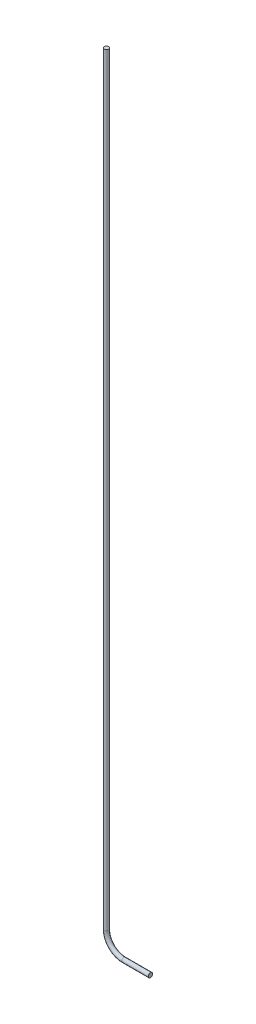
ISO-10303-21;
HEADER;
FILE_DESCRIPTION(('STEP AP214'),'2;1');
FILE_NAME('part.step','',(''),(''),'','','');
FILE_SCHEMA(('AUTOMOTIVE_DESIGN { 1 0 10303 214 1 1 1 1 }'));
ENDSEC;
DATA;
#1=APPLICATION_CONTEXT('core data for automotive mechanical design processes');
#2=APPLICATION_PROTOCOL_DEFINITION('international standard','automotive_design',2000,#1);
#3=PRODUCT_CONTEXT('',#1,'mechanical');
#4=PRODUCT('Part','Part','',(#3));
#5=PRODUCT_RELATED_PRODUCT_CATEGORY('part','',(#4));
#6=PRODUCT_DEFINITION_FORMATION('','',#4);
#7=PRODUCT_DEFINITION_CONTEXT('part definition',#1,'design');
#8=PRODUCT_DEFINITION('design','',#6,#7);
#9=PRODUCT_DEFINITION_SHAPE('','',#8);
#10=(LENGTH_UNIT() NAMED_UNIT(*) SI_UNIT(.MILLI.,.METRE.));
#11=(NAMED_UNIT(*) PLANE_ANGLE_UNIT() SI_UNIT($,.RADIAN.));
#12=(NAMED_UNIT(*) SI_UNIT($,.STERADIAN.) SOLID_ANGLE_UNIT());
#13=UNCERTAINTY_MEASURE_WITH_UNIT(LENGTH_MEASURE(1.E-05),#10,'distance_accuracy_value','');
#14=(GEOMETRIC_REPRESENTATION_CONTEXT(3) GLOBAL_UNCERTAINTY_ASSIGNED_CONTEXT((#13)) GLOBAL_UNIT_ASSIGNED_CONTEXT((#10,
#11,#12)) REPRESENTATION_CONTEXT('',''));
#15=CARTESIAN_POINT('',(0.,0.,0.));
#16=DIRECTION('',(0.,0.,1.));
#17=DIRECTION('',(1.,0.,0.));
#18=AXIS2_PLACEMENT_3D('',#15,#16,#17);
#19=CARTESIAN_POINT('',(127.,0.,0.));
#20=DIRECTION('',(-1.,0.,0.));
#21=DIRECTION('',(0.,0.,1.));
#22=AXIS2_PLACEMENT_3D('',#19,#20,#21);
#23=PLANE('',#22);
#24=CARTESIAN_POINT('',(127.,0.,0.));
#25=DIRECTION('',(-1.,0.,0.));
#26=DIRECTION('',(0.,0.,1.));
#27=AXIS2_PLACEMENT_3D('',#24,#25,#26);
#28=CIRCLE('',#27,6.35);
#29=CARTESIAN_POINT('',(127.,0.,6.35));
#30=VERTEX_POINT('',#29);
#31=EDGE_CURVE('E61',#30,#30,#28,.T.);
#32=ORIENTED_EDGE('',*,*,#31,.F.);
#33=EDGE_LOOP('',(#32));
#34=FACE_BOUND('',#33,.T.);
#35=ADVANCED_FACE('F47',(#34),#23,.F.);
#36=CARTESIAN_POINT('',(0.,2253.996,0.));
#37=DIRECTION('',(0.,1.,0.));
#38=DIRECTION('',(0.,0.,1.));
#39=AXIS2_PLACEMENT_3D('',#36,#37,#38);
#40=PLANE('',#39);
#41=CARTESIAN_POINT('',(0.,2253.996,0.));
#42=DIRECTION('',(0.,1.,0.));
#43=DIRECTION('',(0.,0.,1.));
#44=AXIS2_PLACEMENT_3D('',#41,#42,#43);
#45=CIRCLE('',#44,6.35);
#46=CARTESIAN_POINT('',(0.,2253.996,6.35));
#47=VERTEX_POINT('',#46);
#48=EDGE_CURVE('E11',#47,#47,#45,.T.);
#49=ORIENTED_EDGE('',*,*,#48,.T.);
#50=EDGE_LOOP('',(#49));
#51=FACE_BOUND('',#50,.T.);
#52=ADVANCED_FACE('F70',(#51),#40,.T.);
#53=CARTESIAN_POINT('',(127.,0.,0.));
#54=DIRECTION('',(-1.,0.,0.));
#55=DIRECTION('',(0.,0.,1.));
#56=AXIS2_PLACEMENT_3D('',#53,#54,#55);
#57=CYLINDRICAL_SURFACE('',#56,6.35);
#58=CARTESIAN_POINT('',(50.8000000000003,0.,0.));
#59=DIRECTION('',(-1.,0.,0.));
#60=DIRECTION('',(0.,0.,1.));
#61=AXIS2_PLACEMENT_3D('',#58,#59,#60);
#62=CIRCLE('',#61,6.35);
#63=CARTESIAN_POINT('',(50.8000000000004,-6.35000000000089,0.));
#64=VERTEX_POINT('',#63);
#65=EDGE_CURVE('E57',#64,#64,#62,.T.);
#66=ORIENTED_EDGE('',*,*,#65,.F.);
#67=EDGE_LOOP('',(#66));
#68=FACE_BOUND('',#67,.T.);
#69=ORIENTED_EDGE('',*,*,#31,.T.);
#70=EDGE_LOOP('',(#69));
#71=FACE_BOUND('',#70,.T.);
#72=ADVANCED_FACE('F67',(#68,#71),#57,.T.);
#73=CARTESIAN_POINT('',(50.8,50.8,0.));
#74=DIRECTION('',(0.,0.,-1.));
#75=DIRECTION('',(-1.,0.,0.));
#76=AXIS2_PLACEMENT_3D('',#73,#74,#75);
#77=TOROIDAL_SURFACE('',#76,50.8000000000009,6.35);
#78=CARTESIAN_POINT('',(0.,50.8000000000003,0.));
#79=DIRECTION('',(0.,1.,0.));
#80=DIRECTION('',(0.,0.,1.));
#81=AXIS2_PLACEMENT_3D('',#78,#79,#80);
#82=CIRCLE('',#81,6.35);
#83=CARTESIAN_POINT('',(-6.35000000000089,50.8000000000004,0.));
#84=VERTEX_POINT('',#83);
#85=EDGE_CURVE('E53',#84,#84,#82,.T.);
#86=CARTESIAN_POINT('',(50.8,50.8,0.));
#87=DIRECTION('',(0.,0.,-1.));
#88=DIRECTION('',(-1.,0.,0.));
#89=AXIS2_PLACEMENT_3D('',#86,#87,#88);
#90=CIRCLE('',#89,57.1500000000009);
#91=EDGE_CURVE('',#64,#84,#90,.T.);
#92=ORIENTED_EDGE('',*,*,#65,.T.);
#93=ORIENTED_EDGE('',*,*,#85,.F.);
#94=ORIENTED_EDGE('',*,*,#91,.T.);
#95=ORIENTED_EDGE('',*,*,#91,.F.);
#96=EDGE_LOOP('',(#92,#94,#93,#95));
#97=FACE_BOUND('',#96,.T.);
#98=ADVANCED_FACE('F76',(#97),#77,.T.);
#99=CARTESIAN_POINT('',(0.,50.8000000000003,0.));
#100=DIRECTION('',(0.,1.,0.));
#101=DIRECTION('',(0.,0.,1.));
#102=AXIS2_PLACEMENT_3D('',#99,#100,#101);
#103=CYLINDRICAL_SURFACE('',#102,6.35);
#104=ORIENTED_EDGE('',*,*,#48,.F.);
#105=EDGE_LOOP('',(#104));
#106=FACE_BOUND('',#105,.T.);
#107=ORIENTED_EDGE('',*,*,#85,.T.);
#108=EDGE_LOOP('',(#107));
#109=FACE_BOUND('',#108,.T.);
#110=ADVANCED_FACE('F74',(#106,#109),#103,.T.);
#111=CLOSED_SHELL('',(#35,#52,#72,#98,#110));
#112=MANIFOLD_SOLID_BREP('B2',#111);
#113=ADVANCED_BREP_SHAPE_REPRESENTATION('',(#18,#112),#14);
#114=SHAPE_DEFINITION_REPRESENTATION(#9,#113);
ENDSEC;
END-ISO-10303-21;
